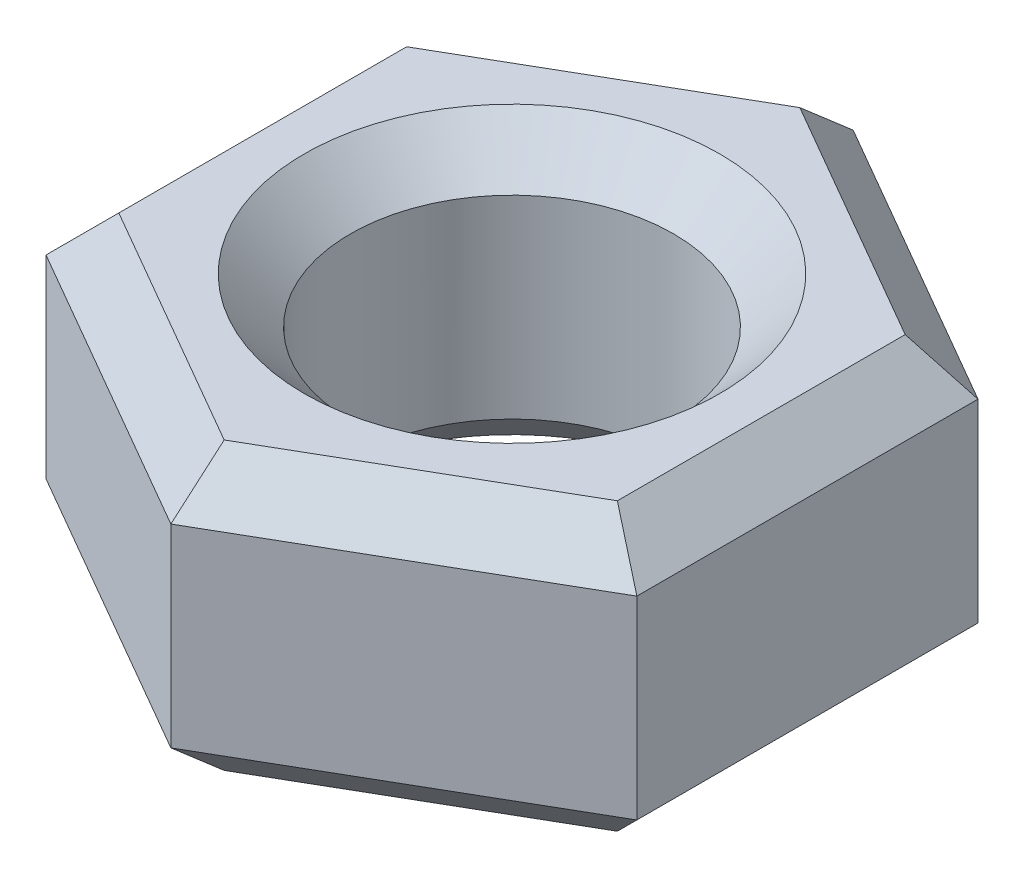
ISO-10303-21;
HEADER;
FILE_DESCRIPTION(('STEP AP214'),'2;1');
FILE_NAME('part.step','',(''),(''),'','','');
FILE_SCHEMA(('AUTOMOTIVE_DESIGN { 1 0 10303 214 1 1 1 1 }'));
ENDSEC;
DATA;
#1=APPLICATION_CONTEXT('core data for automotive mechanical design processes');
#2=APPLICATION_PROTOCOL_DEFINITION('international standard','automotive_design',2000,#1);
#3=PRODUCT_CONTEXT('',#1,'mechanical');
#4=PRODUCT('Part','Part','',(#3));
#5=PRODUCT_RELATED_PRODUCT_CATEGORY('part','',(#4));
#6=PRODUCT_DEFINITION_FORMATION('','',#4);
#7=PRODUCT_DEFINITION_CONTEXT('part definition',#1,'design');
#8=PRODUCT_DEFINITION('design','',#6,#7);
#9=PRODUCT_DEFINITION_SHAPE('','',#8);
#10=(LENGTH_UNIT() NAMED_UNIT(*) SI_UNIT(.MILLI.,.METRE.));
#11=(NAMED_UNIT(*) PLANE_ANGLE_UNIT() SI_UNIT($,.RADIAN.));
#12=(NAMED_UNIT(*) SI_UNIT($,.STERADIAN.) SOLID_ANGLE_UNIT());
#13=UNCERTAINTY_MEASURE_WITH_UNIT(LENGTH_MEASURE(1.E-05),#10,'distance_accuracy_value','');
#14=(GEOMETRIC_REPRESENTATION_CONTEXT(3) GLOBAL_UNCERTAINTY_ASSIGNED_CONTEXT((#13)) GLOBAL_UNIT_ASSIGNED_CONTEXT((#10,
#11,#12)) REPRESENTATION_CONTEXT('',''));
#15=CARTESIAN_POINT('',(0.,0.,0.));
#16=DIRECTION('',(0.,0.,1.));
#17=DIRECTION('',(1.,0.,0.));
#18=AXIS2_PLACEMENT_3D('',#15,#16,#17);
#19=CARTESIAN_POINT('',(0.,6.2,0.));
#20=DIRECTION('',(0.,1.,0.));
#21=DIRECTION('',(0.,0.,1.));
#22=AXIS2_PLACEMENT_3D('',#19,#20,#21);
#23=PLANE('',#22);
#24=CARTESIAN_POINT('',(0.,6.2,0.));
#25=DIRECTION('',(0.,1.,0.));
#26=DIRECTION('',(0.,0.,1.));
#27=AXIS2_PLACEMENT_3D('',#24,#25,#26);
#28=CIRCLE('',#27,4.50000000000001);
#29=CARTESIAN_POINT('',(0.,6.2,4.50000000000001));
#30=VERTEX_POINT('',#29);
#31=EDGE_CURVE('E11',#30,#30,#28,.F.);
#32=ORIENTED_EDGE('',*,*,#31,.T.);
#33=EDGE_LOOP('',(#32));
#34=FACE_BOUND('',#33,.T.);
#35=DIRECTION('',(0.,0.,1.));
#36=VECTOR('',#35,1.);
#37=CARTESIAN_POINT('',(-5.4,6.2,3.69504172281358));
#38=LINE('',#37,#36);
#39=CARTESIAN_POINT('',(-5.39999999999998,6.2,-3.117691453624));
#40=VERTEX_POINT('',#39);
#41=CARTESIAN_POINT('',(-5.4,6.2,3.11769145362395));
#42=VERTEX_POINT('',#41);
#43=EDGE_CURVE('E52',#40,#42,#38,.T.);
#44=ORIENTED_EDGE('',*,*,#43,.T.);
#45=DIRECTION('',(0.866025403784437,0.,0.500000000000003));
#46=VECTOR('',#45,1.);
#47=CARTESIAN_POINT('',(0.499999999999979,6.2,6.52405804184276));
#48=LINE('',#47,#46);
#49=CARTESIAN_POINT('',(0.,6.2,6.23538290724794));
#50=VERTEX_POINT('',#49);
#51=EDGE_CURVE('E44',#42,#50,#48,.T.);
#52=ORIENTED_EDGE('',*,*,#51,.T.);
#53=DIRECTION('',(0.86602540378444,0.,-0.499999999999997));
#54=VECTOR('',#53,1.);
#55=CARTESIAN_POINT('',(5.89999999999998,6.2,2.82901631902918));
#56=LINE('',#55,#54);
#57=CARTESIAN_POINT('',(5.39999999999998,6.2,3.11769145362399));
#58=VERTEX_POINT('',#57);
#59=EDGE_CURVE('E191',#50,#58,#56,.T.);
#60=ORIENTED_EDGE('',*,*,#59,.T.);
#61=DIRECTION('',(0.,0.,-1.));
#62=VECTOR('',#61,1.);
#63=CARTESIAN_POINT('',(5.40000000000002,6.2,-3.69504172281359));
#64=LINE('',#63,#62);
#65=CARTESIAN_POINT('',(5.40000000000001,6.2,-3.11769145362396));
#66=VERTEX_POINT('',#65);
#67=EDGE_CURVE('E193',#58,#66,#64,.T.);
#68=ORIENTED_EDGE('',*,*,#67,.T.);
#69=DIRECTION('',(-0.866025403784437,0.,-0.500000000000003));
#70=VECTOR('',#69,1.);
#71=CARTESIAN_POINT('',(-0.499999999999975,6.2,-6.52405804184278));
#72=LINE('',#71,#70);
#73=CARTESIAN_POINT('',(0.,6.2,-6.23538290724796));
#74=VERTEX_POINT('',#73);
#75=EDGE_CURVE('E195',#66,#74,#72,.T.);
#76=ORIENTED_EDGE('',*,*,#75,.T.);
#77=DIRECTION('',(-0.86602540378444,0.,0.499999999999997));
#78=VECTOR('',#77,1.);
#79=CARTESIAN_POINT('',(-5.89999999999999,6.2,-2.82901631902919));
#80=LINE('',#79,#78);
#81=EDGE_CURVE('E57',#74,#40,#80,.T.);
#82=ORIENTED_EDGE('',*,*,#81,.T.);
#83=EDGE_LOOP('',(#44,#52,#60,#68,#76,#82));
#84=FACE_BOUND('',#83,.T.);
#85=ADVANCED_FACE('F35',(#34,#84),#23,.T.);
#86=CARTESIAN_POINT('',(0.,0.,0.));
#87=DIRECTION('',(0.,1.,0.));
#88=DIRECTION('',(0.,0.,1.));
#89=AXIS2_PLACEMENT_3D('',#86,#87,#88);
#90=PLANE('',#89);
#91=CARTESIAN_POINT('',(0.,0.,0.));
#92=DIRECTION('',(0.,1.,0.));
#93=DIRECTION('',(0.,0.,1.));
#94=AXIS2_PLACEMENT_3D('',#91,#92,#93);
#95=CIRCLE('',#94,4.49999999999999);
#96=CARTESIAN_POINT('',(0.,0.,4.49999999999999));
#97=VERTEX_POINT('',#96);
#98=EDGE_CURVE('E153',#97,#97,#95,.T.);
#99=ORIENTED_EDGE('',*,*,#98,.T.);
#100=EDGE_LOOP('',(#99));
#101=FACE_BOUND('',#100,.T.);
#102=DIRECTION('',(0.866025403784437,0.,0.500000000000003));
#103=VECTOR('',#102,1.);
#104=CARTESIAN_POINT('',(2.70000000000002,0.,-4.67653718043596));
#105=LINE('',#104,#103);
#106=CARTESIAN_POINT('',(0.,0.,-6.23538290724796));
#107=VERTEX_POINT('',#106);
#108=CARTESIAN_POINT('',(5.40000000000002,0.,-3.11769145362396));
#109=VERTEX_POINT('',#108);
#110=EDGE_CURVE('E152',#107,#109,#105,.T.);
#111=ORIENTED_EDGE('',*,*,#110,.T.);
#112=DIRECTION('',(0.,0.,1.));
#113=VECTOR('',#112,1.);
#114=CARTESIAN_POINT('',(5.4,0.,0.));
#115=LINE('',#114,#113);
#116=CARTESIAN_POINT('',(5.39999999999998,0.,3.11769145362399));
#117=VERTEX_POINT('',#116);
#118=EDGE_CURVE('E131',#109,#117,#115,.T.);
#119=ORIENTED_EDGE('',*,*,#118,.T.);
#120=DIRECTION('',(-0.86602540378444,0.,0.499999999999997));
#121=VECTOR('',#120,1.);
#122=CARTESIAN_POINT('',(2.69999999999998,0.,4.67653718043597));
#123=LINE('',#122,#121);
#124=CARTESIAN_POINT('',(0.,0.,6.23538290724794));
#125=VERTEX_POINT('',#124);
#126=EDGE_CURVE('E141',#117,#125,#123,.T.);
#127=ORIENTED_EDGE('',*,*,#126,.T.);
#128=DIRECTION('',(-0.866025403784437,0.,-0.500000000000003));
#129=VECTOR('',#128,1.);
#130=CARTESIAN_POINT('',(-2.70000000000001,0.,4.67653718043595));
#131=LINE('',#130,#129);
#132=CARTESIAN_POINT('',(-5.4,0.,3.11769145362395));
#133=VERTEX_POINT('',#132);
#134=EDGE_CURVE('E147',#125,#133,#131,.T.);
#135=ORIENTED_EDGE('',*,*,#134,.T.);
#136=DIRECTION('',(0.,0.,-1.));
#137=VECTOR('',#136,1.);
#138=CARTESIAN_POINT('',(-5.39999999999999,0.,0.));
#139=LINE('',#138,#137);
#140=CARTESIAN_POINT('',(-5.39999999999999,0.,-3.117691453624));
#141=VERTEX_POINT('',#140);
#142=EDGE_CURVE('E253',#133,#141,#139,.T.);
#143=ORIENTED_EDGE('',*,*,#142,.T.);
#144=DIRECTION('',(0.86602540378444,0.,-0.499999999999997));
#145=VECTOR('',#144,1.);
#146=CARTESIAN_POINT('',(-2.69999999999999,0.,-4.67653718043598));
#147=LINE('',#146,#145);
#148=EDGE_CURVE('E158',#141,#107,#147,.T.);
#149=ORIENTED_EDGE('',*,*,#148,.T.);
#150=EDGE_LOOP('',(#111,#119,#127,#135,#143,#149));
#151=FACE_BOUND('',#150,.T.);
#152=ADVANCED_FACE('F150',(#101,#151),#90,.F.);
#153=CARTESIAN_POINT('',(0.,6.2,7.3900834456272));
#154=DIRECTION('',(-0.499999999999997,0.,-0.86602540378444));
#155=DIRECTION('',(-0.866025403784441,0.,0.499999999999997));
#156=AXIS2_PLACEMENT_3D('',#153,#154,#155);
#157=PLANE('',#156);
#158=DIRECTION('',(0.,-1.,0.));
#159=VECTOR('',#158,1.);
#160=CARTESIAN_POINT('',(0.,6.2,7.3900834456272));
#161=LINE('',#160,#159);
#162=CARTESIAN_POINT('',(0.,5.19999999999999,7.3900834456272));
#163=VERTEX_POINT('',#162);
#164=CARTESIAN_POINT('',(0.,0.999999999999999,7.3900834456272));
#165=VERTEX_POINT('',#164);
#166=EDGE_CURVE('E210',#163,#165,#161,.T.);
#167=ORIENTED_EDGE('',*,*,#166,.T.);
#168=DIRECTION('',(0.866025403784441,0.,-0.499999999999997));
#169=VECTOR('',#168,1.);
#170=CARTESIAN_POINT('',(0.,0.999999999999997,7.3900834456272));
#171=LINE('',#170,#169);
#172=CARTESIAN_POINT('',(6.39999999999997,0.999999999999999,3.69504172281362));
#173=VERTEX_POINT('',#172);
#174=EDGE_CURVE('E189',#165,#173,#171,.T.);
#175=ORIENTED_EDGE('',*,*,#174,.T.);
#176=DIRECTION('',(0.,-1.,0.));
#177=VECTOR('',#176,1.);
#178=CARTESIAN_POINT('',(6.39999999999997,6.2,3.69504172281362));
#179=LINE('',#178,#177);
#180=CARTESIAN_POINT('',(6.39999999999997,5.19999999999999,3.69504172281362));
#181=VERTEX_POINT('',#180);
#182=EDGE_CURVE('E148',#181,#173,#179,.T.);
#183=ORIENTED_EDGE('',*,*,#182,.F.);
#184=DIRECTION('',(-0.866025403784441,0.,0.499999999999997));
#185=VECTOR('',#184,1.);
#186=CARTESIAN_POINT('',(0.,5.19999999999999,7.3900834456272));
#187=LINE('',#186,#185);
#188=EDGE_CURVE('E187',#181,#163,#187,.T.);
#189=ORIENTED_EDGE('',*,*,#188,.T.);
#190=EDGE_LOOP('',(#167,#175,#183,#189));
#191=FACE_BOUND('',#190,.T.);
#192=ADVANCED_FACE('F277',(#191),#157,.F.);
#193=CARTESIAN_POINT('',(6.39999999999997,6.2,3.69504172281362));
#194=DIRECTION('',(-1.,0.,0.));
#195=DIRECTION('',(0.,0.,1.));
#196=AXIS2_PLACEMENT_3D('',#193,#194,#195);
#197=PLANE('',#196);
#198=ORIENTED_EDGE('',*,*,#182,.T.);
#199=DIRECTION('',(0.,0.,-1.));
#200=VECTOR('',#199,1.);
#201=CARTESIAN_POINT('',(6.39999999999997,0.999999999999997,3.69504172281362));
#202=LINE('',#201,#200);
#203=CARTESIAN_POINT('',(6.40000000000002,0.999999999999999,-3.69504172281359));
#204=VERTEX_POINT('',#203);
#205=EDGE_CURVE('E134',#173,#204,#202,.T.);
#206=ORIENTED_EDGE('',*,*,#205,.T.);
#207=DIRECTION('',(0.,-1.,0.));
#208=VECTOR('',#207,1.);
#209=CARTESIAN_POINT('',(6.40000000000002,6.2,-3.69504172281359));
#210=LINE('',#209,#208);
#211=CARTESIAN_POINT('',(6.40000000000002,5.19999999999999,-3.69504172281359));
#212=VERTEX_POINT('',#211);
#213=EDGE_CURVE('E239',#212,#204,#210,.T.);
#214=ORIENTED_EDGE('',*,*,#213,.F.);
#215=DIRECTION('',(0.,0.,1.));
#216=VECTOR('',#215,1.);
#217=CARTESIAN_POINT('',(6.39999999999997,5.19999999999999,3.69504172281362));
#218=LINE('',#217,#216);
#219=EDGE_CURVE('E167',#212,#181,#218,.T.);
#220=ORIENTED_EDGE('',*,*,#219,.T.);
#221=EDGE_LOOP('',(#198,#206,#214,#220));
#222=FACE_BOUND('',#221,.T.);
#223=ADVANCED_FACE('F244',(#222),#197,.F.);
#224=CARTESIAN_POINT('',(6.40000000000002,6.2,-3.69504172281359));
#225=DIRECTION('',(-0.500000000000003,0.,0.866025403784437));
#226=DIRECTION('',(0.866025403784437,0.,0.500000000000003));
#227=AXIS2_PLACEMENT_3D('',#224,#225,#226);
#228=PLANE('',#227);
#229=ORIENTED_EDGE('',*,*,#213,.T.);
#230=DIRECTION('',(-0.866025403784437,0.,-0.500000000000003));
#231=VECTOR('',#230,1.);
#232=CARTESIAN_POINT('',(6.40000000000002,0.999999999999997,-3.69504172281359));
#233=LINE('',#232,#231);
#234=CARTESIAN_POINT('',(0.,0.999999999999999,-7.39008344562722));
#235=VERTEX_POINT('',#234);
#236=EDGE_CURVE('E172',#204,#235,#233,.T.);
#237=ORIENTED_EDGE('',*,*,#236,.T.);
#238=DIRECTION('',(0.,-1.,0.));
#239=VECTOR('',#238,1.);
#240=CARTESIAN_POINT('',(0.,6.2,-7.39008344562722));
#241=LINE('',#240,#239);
#242=CARTESIAN_POINT('',(0.,5.19999999999999,-7.39008344562722));
#243=VERTEX_POINT('',#242);
#244=EDGE_CURVE('E241',#243,#235,#241,.T.);
#245=ORIENTED_EDGE('',*,*,#244,.F.);
#246=DIRECTION('',(0.866025403784437,0.,0.500000000000003));
#247=VECTOR('',#246,1.);
#248=CARTESIAN_POINT('',(6.40000000000002,5.19999999999999,-3.69504172281359));
#249=LINE('',#248,#247);
#250=EDGE_CURVE('E170',#243,#212,#249,.T.);
#251=ORIENTED_EDGE('',*,*,#250,.T.);
#252=EDGE_LOOP('',(#229,#237,#245,#251));
#253=FACE_BOUND('',#252,.T.);
#254=ADVANCED_FACE('F238',(#253),#228,.F.);
#255=CARTESIAN_POINT('',(0.,6.2,-7.39008344562722));
#256=DIRECTION('',(0.499999999999997,0.,0.86602540378444));
#257=DIRECTION('',(0.86602540378444,0.,-0.499999999999997));
#258=AXIS2_PLACEMENT_3D('',#255,#256,#257);
#259=PLANE('',#258);
#260=ORIENTED_EDGE('',*,*,#244,.T.);
#261=DIRECTION('',(-0.86602540378444,0.,0.499999999999997));
#262=VECTOR('',#261,1.);
#263=CARTESIAN_POINT('',(0.,0.999999999999997,-7.39008344562722));
#264=LINE('',#263,#262);
#265=CARTESIAN_POINT('',(-6.39999999999999,0.999999999999999,-3.69504172281363));
#266=VERTEX_POINT('',#265);
#267=EDGE_CURVE('E176',#235,#266,#264,.T.);
#268=ORIENTED_EDGE('',*,*,#267,.T.);
#269=DIRECTION('',(0.,-1.,0.));
#270=VECTOR('',#269,1.);
#271=CARTESIAN_POINT('',(-6.39999999999999,6.2,-3.69504172281363));
#272=LINE('',#271,#270);
#273=CARTESIAN_POINT('',(-6.39999999999999,5.19999999999999,-3.69504172281363));
#274=VERTEX_POINT('',#273);
#275=EDGE_CURVE('E248',#274,#266,#272,.T.);
#276=ORIENTED_EDGE('',*,*,#275,.F.);
#277=DIRECTION('',(0.86602540378444,0.,-0.499999999999997));
#278=VECTOR('',#277,1.);
#279=CARTESIAN_POINT('',(0.,5.19999999999999,-7.39008344562722));
#280=LINE('',#279,#278);
#281=EDGE_CURVE('E174',#274,#243,#280,.T.);
#282=ORIENTED_EDGE('',*,*,#281,.T.);
#283=EDGE_LOOP('',(#260,#268,#276,#282));
#284=FACE_BOUND('',#283,.T.);
#285=ADVANCED_FACE('F265',(#284),#259,.F.);
#286=CARTESIAN_POINT('',(-6.39999999999999,6.2,-3.69504172281363));
#287=DIRECTION('',(1.,0.,0.));
#288=DIRECTION('',(0.,0.,-1.));
#289=AXIS2_PLACEMENT_3D('',#286,#287,#288);
#290=PLANE('',#289);
#291=ORIENTED_EDGE('',*,*,#275,.T.);
#292=DIRECTION('',(0.,0.,1.));
#293=VECTOR('',#292,1.);
#294=CARTESIAN_POINT('',(-6.39999999999999,0.999999999999997,-3.69504172281363));
#295=LINE('',#294,#293);
#296=CARTESIAN_POINT('',(-6.4,0.999999999999998,3.69504172281358));
#297=VERTEX_POINT('',#296);
#298=EDGE_CURVE('E180',#266,#297,#295,.T.);
#299=ORIENTED_EDGE('',*,*,#298,.T.);
#300=DIRECTION('',(0.,-1.,0.));
#301=VECTOR('',#300,1.);
#302=CARTESIAN_POINT('',(-6.4,6.2,3.69504172281358));
#303=LINE('',#302,#301);
#304=CARTESIAN_POINT('',(-6.4,5.19999999999999,3.69504172281358));
#305=VERTEX_POINT('',#304);
#306=EDGE_CURVE('E270',#305,#297,#303,.T.);
#307=ORIENTED_EDGE('',*,*,#306,.F.);
#308=DIRECTION('',(0.,0.,-1.));
#309=VECTOR('',#308,1.);
#310=CARTESIAN_POINT('',(-6.39999999999999,5.19999999999999,-3.69504172281363));
#311=LINE('',#310,#309);
#312=EDGE_CURVE('E178',#305,#274,#311,.T.);
#313=ORIENTED_EDGE('',*,*,#312,.T.);
#314=EDGE_LOOP('',(#291,#299,#307,#313));
#315=FACE_BOUND('',#314,.T.);
#316=ADVANCED_FACE('F288',(#315),#290,.F.);
#317=CARTESIAN_POINT('',(-6.4,6.2,3.69504172281358));
#318=DIRECTION('',(0.500000000000003,0.,-0.866025403784437));
#319=DIRECTION('',(-0.866025403784437,0.,-0.500000000000003));
#320=AXIS2_PLACEMENT_3D('',#317,#318,#319);
#321=PLANE('',#320);
#322=ORIENTED_EDGE('',*,*,#306,.T.);
#323=DIRECTION('',(0.866025403784437,0.,0.500000000000003));
#324=VECTOR('',#323,1.);
#325=CARTESIAN_POINT('',(-6.4,0.999999999999997,3.69504172281358));
#326=LINE('',#325,#324);
#327=EDGE_CURVE('E185',#297,#165,#326,.T.);
#328=ORIENTED_EDGE('',*,*,#327,.T.);
#329=ORIENTED_EDGE('',*,*,#166,.F.);
#330=DIRECTION('',(-0.866025403784437,0.,-0.500000000000003));
#331=VECTOR('',#330,1.);
#332=CARTESIAN_POINT('',(-6.4,5.19999999999999,3.69504172281358));
#333=LINE('',#332,#331);
#334=EDGE_CURVE('E182',#163,#305,#333,.T.);
#335=ORIENTED_EDGE('',*,*,#334,.T.);
#336=EDGE_LOOP('',(#322,#328,#329,#335));
#337=FACE_BOUND('',#336,.T.);
#338=ADVANCED_FACE('F289',(#337),#321,.F.);
#339=CARTESIAN_POINT('',(0.,6.2,0.));
#340=DIRECTION('',(0.,-1.,0.));
#341=DIRECTION('',(0.,0.,-1.));
#342=AXIS2_PLACEMENT_3D('',#339,#340,#341);
#343=CYLINDRICAL_SURFACE('',#342,3.5);
#344=CARTESIAN_POINT('',(0.,0.999999999999995,0.));
#345=DIRECTION('',(0.,1.,0.));
#346=DIRECTION('',(0.,0.,1.));
#347=AXIS2_PLACEMENT_3D('',#344,#345,#346);
#348=CIRCLE('',#347,3.5);
#349=CARTESIAN_POINT('',(0.,0.999999999999994,-3.5));
#350=VERTEX_POINT('',#349);
#351=EDGE_CURVE('E164',#350,#350,#348,.F.);
#352=CARTESIAN_POINT('',(0.,5.19999999999999,0.));
#353=DIRECTION('',(0.,1.,0.));
#354=DIRECTION('',(0.,0.,1.));
#355=AXIS2_PLACEMENT_3D('',#352,#353,#354);
#356=CIRCLE('',#355,3.5);
#357=CARTESIAN_POINT('',(0.,5.19999999999999,-3.5));
#358=VERTEX_POINT('',#357);
#359=EDGE_CURVE('E156',#358,#358,#356,.T.);
#360=CARTESIAN_POINT('',(0.,0.999999999999994,-3.5));
#361=CARTESIAN_POINT('',(0.,1.04374999999999,-3.5));
#362=CARTESIAN_POINT('',(0.,1.08749999999999,-3.5));
#363=CARTESIAN_POINT('',(0.,1.17499999999999,-3.5));
#364=CARTESIAN_POINT('',(0.,1.21874999999999,-3.5));
#365=CARTESIAN_POINT('',(0.,1.30624999999999,-3.5));
#366=CARTESIAN_POINT('',(0.,1.34999999999999,-3.5));
#367=CARTESIAN_POINT('',(0.,1.43749999999999,-3.5));
#368=CARTESIAN_POINT('',(0.,1.48124999999999,-3.5));
#369=CARTESIAN_POINT('',(0.,1.56874999999999,-3.5));
#370=CARTESIAN_POINT('',(0.,1.61249999999999,-3.5));
#371=CARTESIAN_POINT('',(0.,1.69999999999999,-3.5));
#372=CARTESIAN_POINT('',(0.,1.74374999999999,-3.5));
#373=CARTESIAN_POINT('',(0.,1.83124999999999,-3.5));
#374=CARTESIAN_POINT('',(0.,1.87499999999999,-3.5));
#375=CARTESIAN_POINT('',(0.,1.96249999999999,-3.5));
#376=CARTESIAN_POINT('',(0.,2.00624999999999,-3.5));
#377=CARTESIAN_POINT('',(0.,2.09374999999999,-3.5));
#378=CARTESIAN_POINT('',(0.,2.13749999999999,-3.5));
#379=CARTESIAN_POINT('',(0.,2.22499999999999,-3.5));
#380=CARTESIAN_POINT('',(0.,2.26874999999999,-3.5));
#381=CARTESIAN_POINT('',(0.,2.35624999999999,-3.5));
#382=CARTESIAN_POINT('',(0.,2.39999999999999,-3.5));
#383=CARTESIAN_POINT('',(0.,2.48749999999999,-3.5));
#384=CARTESIAN_POINT('',(0.,2.53124999999999,-3.5));
#385=CARTESIAN_POINT('',(0.,2.61874999999999,-3.5));
#386=CARTESIAN_POINT('',(0.,2.66249999999999,-3.5));
#387=CARTESIAN_POINT('',(0.,2.74999999999999,-3.5));
#388=CARTESIAN_POINT('',(0.,2.79374999999999,-3.5));
#389=CARTESIAN_POINT('',(0.,2.88124999999999,-3.5));
#390=CARTESIAN_POINT('',(0.,2.92499999999999,-3.5));
#391=CARTESIAN_POINT('',(0.,3.01249999999999,-3.5));
#392=CARTESIAN_POINT('',(0.,3.05624999999999,-3.5));
#393=CARTESIAN_POINT('',(0.,3.14374999999999,-3.5));
#394=CARTESIAN_POINT('',(0.,3.18749999999999,-3.5));
#395=CARTESIAN_POINT('',(0.,3.27499999999999,-3.5));
#396=CARTESIAN_POINT('',(0.,3.31874999999999,-3.5));
#397=CARTESIAN_POINT('',(0.,3.40624999999999,-3.5));
#398=CARTESIAN_POINT('',(0.,3.44999999999999,-3.5));
#399=CARTESIAN_POINT('',(0.,3.53749999999999,-3.5));
#400=CARTESIAN_POINT('',(0.,3.58124999999999,-3.5));
#401=CARTESIAN_POINT('',(0.,3.66874999999999,-3.5));
#402=CARTESIAN_POINT('',(0.,3.71249999999999,-3.5));
#403=CARTESIAN_POINT('',(0.,3.79999999999999,-3.5));
#404=CARTESIAN_POINT('',(0.,3.84374999999999,-3.5));
#405=CARTESIAN_POINT('',(0.,3.93124999999999,-3.5));
#406=CARTESIAN_POINT('',(0.,3.97499999999999,-3.5));
#407=CARTESIAN_POINT('',(0.,4.06249999999999,-3.5));
#408=CARTESIAN_POINT('',(0.,4.10624999999999,-3.5));
#409=CARTESIAN_POINT('',(0.,4.19374999999999,-3.5));
#410=CARTESIAN_POINT('',(0.,4.23749999999999,-3.5));
#411=CARTESIAN_POINT('',(0.,4.32499999999999,-3.5));
#412=CARTESIAN_POINT('',(0.,4.36874999999999,-3.5));
#413=CARTESIAN_POINT('',(0.,4.45624999999999,-3.5));
#414=CARTESIAN_POINT('',(0.,4.49999999999999,-3.5));
#415=CARTESIAN_POINT('',(0.,4.58749999999999,-3.5));
#416=CARTESIAN_POINT('',(0.,4.63124999999999,-3.5));
#417=CARTESIAN_POINT('',(0.,4.71874999999999,-3.5));
#418=CARTESIAN_POINT('',(0.,4.76249999999999,-3.5));
#419=CARTESIAN_POINT('',(0.,4.84999999999999,-3.5));
#420=CARTESIAN_POINT('',(0.,4.89374999999999,-3.5));
#421=CARTESIAN_POINT('',(0.,4.98124999999999,-3.5));
#422=CARTESIAN_POINT('',(0.,5.02499999999999,-3.5));
#423=CARTESIAN_POINT('',(0.,5.11249999999999,-3.5));
#424=CARTESIAN_POINT('',(0.,5.15624999999999,-3.5));
#425=CARTESIAN_POINT('',(0.,5.19999999999999,-3.5));
#426=B_SPLINE_CURVE_WITH_KNOTS('',3,(#360,#361,#362,#363,#364,#365,#366,#367,#368,#369,#370,
#371,#372,#373,#374,#375,#376,#377,#378,#379,#380,#381,#382,#383,#384,#385,#386,#387,#388,#389,
#390,#391,#392,#393,#394,#395,#396,#397,#398,#399,#400,#401,#402,#403,#404,#405,#406,#407,#408,
#409,#410,#411,#412,#413,#414,#415,#416,#417,#418,#419,#420,#421,#422,#423,#424,#425),
.UNSPECIFIED.,.F.,.F.,(4,2,2,2,2,2,2,2,2,2,2,2,2,2,2,2,2,2,2,2,2,2,2,2,2,2,2,2,2,2,2,2,4),(0.,
0.13125,0.2625,0.39375,0.524999999999999,0.65625,0.7875,0.918749999999999,1.05,1.18125,1.3125,
1.44375,1.575,1.70625,1.8375,1.96875,2.1,2.23125,2.3625,2.49375,2.625,2.75625,2.8875,3.01875,
3.15,3.28125,3.4125,3.54375,3.675,3.80625,3.9375,4.06875,4.2),.UNSPECIFIED.);
#427=EDGE_CURVE('BSEAM308',#350,#358,#426,.T.);
#428=ORIENTED_EDGE('',*,*,#351,.T.);
#429=ORIENTED_EDGE('',*,*,#359,.T.);
#430=ORIENTED_EDGE('',*,*,#427,.T.);
#431=ORIENTED_EDGE('',*,*,#427,.F.);
#432=EDGE_LOOP('',(#428,#430,#429,#431));
#433=FACE_BOUND('',#432,.T.);
#434=ADVANCED_FACE('F308',(#433),#343,.F.);
#435=CARTESIAN_POINT('',(0.,0.,0.));
#436=DIRECTION('',(0.,-1.,0.));
#437=DIRECTION('',(0.,0.,-1.));
#438=AXIS2_PLACEMENT_3D('',#435,#436,#437);
#439=CONICAL_SURFACE('',#438,4.49999999999999,0.785398163397446);
#440=ORIENTED_EDGE('',*,*,#351,.F.);
#441=EDGE_LOOP('',(#440));
#442=FACE_BOUND('',#441,.T.);
#443=ORIENTED_EDGE('',*,*,#98,.F.);
#444=EDGE_LOOP('',(#443));
#445=FACE_BOUND('',#444,.T.);
#446=ADVANCED_FACE('F322',(#442,#445),#439,.F.);
#447=CARTESIAN_POINT('',(-6.39999999999999,0.999999999999997,-3.69504172281363));
#448=DIRECTION('',(0.707106781186547,0.707106781186548,0.));
#449=DIRECTION('',(0.,0.,1.));
#450=AXIS2_PLACEMENT_3D('',#447,#448,#449);
#451=PLANE('',#450);
#452=DIRECTION('',(0.654653670707977,-0.654653670707976,0.37796447300923));
#453=VECTOR('',#452,1.);
#454=CARTESIAN_POINT('',(-6.39999999999999,0.999999999999997,-3.69504172281363));
#455=LINE('',#454,#453);
#456=EDGE_CURVE('E204',#141,#266,#455,.F.);
#457=ORIENTED_EDGE('',*,*,#456,.F.);
#458=ORIENTED_EDGE('',*,*,#142,.F.);
#459=DIRECTION('',(0.654653670707978,-0.654653670707976,-0.377964473009226));
#460=VECTOR('',#459,1.);
#461=CARTESIAN_POINT('',(-6.4,0.999999999999997,3.69504172281358));
#462=LINE('',#461,#460);
#463=EDGE_CURVE('E207',#297,#133,#462,.T.);
#464=ORIENTED_EDGE('',*,*,#463,.F.);
#465=ORIENTED_EDGE('',*,*,#298,.F.);
#466=EDGE_LOOP('',(#457,#458,#464,#465));
#467=FACE_BOUND('',#466,.T.);
#468=ADVANCED_FACE('F286',(#467),#451,.F.);
#469=CARTESIAN_POINT('',(-6.4,0.999999999999997,3.69504172281358));
#470=DIRECTION('',(0.353553390593275,0.707106781186549,-0.612372435695792));
#471=DIRECTION('',(0.866025403784437,0.,0.500000000000003));
#472=AXIS2_PLACEMENT_3D('',#469,#470,#471);
#473=PLANE('',#472);
#474=ORIENTED_EDGE('',*,*,#463,.T.);
#475=ORIENTED_EDGE('',*,*,#134,.F.);
#476=DIRECTION('',(0.,-0.654653670707976,-0.755928946018455));
#477=VECTOR('',#476,1.);
#478=CARTESIAN_POINT('',(0.,0.999999999999997,7.3900834456272));
#479=LINE('',#478,#477);
#480=EDGE_CURVE('E144',#165,#125,#479,.T.);
#481=ORIENTED_EDGE('',*,*,#480,.F.);
#482=ORIENTED_EDGE('',*,*,#327,.F.);
#483=EDGE_LOOP('',(#474,#475,#481,#482));
#484=FACE_BOUND('',#483,.T.);
#485=ADVANCED_FACE('F283',(#484),#473,.F.);
#486=CARTESIAN_POINT('',(0.,0.999999999999997,-7.39008344562722));
#487=DIRECTION('',(0.353553390593271,0.707106781186548,0.612372435695795));
#488=DIRECTION('',(-0.86602540378444,0.,0.499999999999997));
#489=AXIS2_PLACEMENT_3D('',#486,#487,#488);
#490=PLANE('',#489);
#491=ORIENTED_EDGE('',*,*,#456,.T.);
#492=ORIENTED_EDGE('',*,*,#267,.F.);
#493=DIRECTION('',(0.,-0.654653670707976,0.755928946018456));
#494=VECTOR('',#493,1.);
#495=CARTESIAN_POINT('',(0.,0.999999999999997,-7.39008344562722));
#496=LINE('',#495,#494);
#497=EDGE_CURVE('E137',#107,#235,#496,.F.);
#498=ORIENTED_EDGE('',*,*,#497,.F.);
#499=ORIENTED_EDGE('',*,*,#148,.F.);
#500=EDGE_LOOP('',(#491,#492,#498,#499));
#501=FACE_BOUND('',#500,.T.);
#502=ADVANCED_FACE('F260',(#501),#490,.F.);
#503=CARTESIAN_POINT('',(0.,0.999999999999997,7.3900834456272));
#504=DIRECTION('',(-0.353553390593271,0.707106781186549,-0.612372435695795));
#505=DIRECTION('',(0.866025403784441,0.,-0.499999999999997));
#506=AXIS2_PLACEMENT_3D('',#503,#504,#505);
#507=PLANE('',#506);
#508=ORIENTED_EDGE('',*,*,#480,.T.);
#509=ORIENTED_EDGE('',*,*,#126,.F.);
#510=DIRECTION('',(0.654653670707975,0.654653670707977,0.377964473009232));
#511=VECTOR('',#510,1.);
#512=CARTESIAN_POINT('',(4.57142857142856,-0.828571428571417,2.63931551629544));
#513=LINE('',#512,#511);
#514=EDGE_CURVE('E127',#173,#117,#513,.F.);
#515=ORIENTED_EDGE('',*,*,#514,.F.);
#516=ORIENTED_EDGE('',*,*,#174,.F.);
#517=EDGE_LOOP('',(#508,#509,#515,#516));
#518=FACE_BOUND('',#517,.T.);
#519=ADVANCED_FACE('F142',(#518),#507,.F.);
#520=CARTESIAN_POINT('',(6.40000000000002,0.999999999999997,-3.69504172281359));
#521=DIRECTION('',(-0.353553390593275,0.707106781186549,0.612372435695792));
#522=DIRECTION('',(-0.866025403784437,0.,-0.500000000000003));
#523=AXIS2_PLACEMENT_3D('',#520,#521,#522);
#524=PLANE('',#523);
#525=ORIENTED_EDGE('',*,*,#497,.T.);
#526=ORIENTED_EDGE('',*,*,#236,.F.);
#527=DIRECTION('',(-0.654653670707979,-0.654653670707976,0.377964473009226));
#528=VECTOR('',#527,1.);
#529=CARTESIAN_POINT('',(6.40000000000002,0.999999999999997,-3.69504172281359));
#530=LINE('',#529,#528);
#531=EDGE_CURVE('E138',#109,#204,#530,.F.);
#532=ORIENTED_EDGE('',*,*,#531,.F.);
#533=ORIENTED_EDGE('',*,*,#110,.F.);
#534=EDGE_LOOP('',(#525,#526,#532,#533));
#535=FACE_BOUND('',#534,.T.);
#536=ADVANCED_FACE('F263',(#535),#524,.F.);
#537=CARTESIAN_POINT('',(6.39999999999997,0.999999999999997,3.69504172281362));
#538=DIRECTION('',(-0.707106781186547,0.707106781186548,0.));
#539=DIRECTION('',(0.,0.,-1.));
#540=AXIS2_PLACEMENT_3D('',#537,#538,#539);
#541=PLANE('',#540);
#542=ORIENTED_EDGE('',*,*,#514,.T.);
#543=ORIENTED_EDGE('',*,*,#118,.F.);
#544=ORIENTED_EDGE('',*,*,#531,.T.);
#545=ORIENTED_EDGE('',*,*,#205,.F.);
#546=EDGE_LOOP('',(#542,#543,#544,#545));
#547=FACE_BOUND('',#546,.T.);
#548=ADVANCED_FACE('F129',(#547),#541,.F.);
#549=CARTESIAN_POINT('',(0.,5.19999999999999,0.));
#550=DIRECTION('',(0.,1.,0.));
#551=DIRECTION('',(0.,0.,1.));
#552=AXIS2_PLACEMENT_3D('',#549,#550,#551);
#553=CONICAL_SURFACE('',#552,3.5,0.78539816339745);
#554=ORIENTED_EDGE('',*,*,#31,.F.);
#555=EDGE_LOOP('',(#554));
#556=FACE_BOUND('',#555,.T.);
#557=ORIENTED_EDGE('',*,*,#359,.F.);
#558=EDGE_LOOP('',(#557));
#559=FACE_BOUND('',#558,.T.);
#560=ADVANCED_FACE('F328',(#556,#559),#553,.F.);
#561=CARTESIAN_POINT('',(2.70000000000002,6.2,-4.67653718043596));
#562=DIRECTION('',(0.353553390593276,0.707106781186547,-0.612372435695794));
#563=DIRECTION('',(0.866025403784437,0.,0.500000000000003));
#564=AXIS2_PLACEMENT_3D('',#561,#562,#563);
#565=PLANE('',#564);
#566=DIRECTION('',(-0.654653670707977,0.654653670707978,0.377964473009225));
#567=VECTOR('',#566,1.);
#568=CARTESIAN_POINT('',(4.62857142857144,6.97142857142858,-2.67230696024911));
#569=LINE('',#568,#567);
#570=EDGE_CURVE('E220',#212,#66,#569,.T.);
#571=ORIENTED_EDGE('',*,*,#570,.F.);
#572=ORIENTED_EDGE('',*,*,#250,.F.);
#573=DIRECTION('',(0.,0.654653670707978,0.755928946018454));
#574=VECTOR('',#573,1.);
#575=CARTESIAN_POINT('',(0.,6.97142857142857,-5.34461392049826));
#576=LINE('',#575,#574);
#577=EDGE_CURVE('E39',#74,#243,#576,.F.);
#578=ORIENTED_EDGE('',*,*,#577,.F.);
#579=ORIENTED_EDGE('',*,*,#75,.F.);
#580=EDGE_LOOP('',(#571,#572,#578,#579));
#581=FACE_BOUND('',#580,.T.);
#582=ADVANCED_FACE('F37',(#581),#565,.T.);
#583=CARTESIAN_POINT('',(-2.69999999999998,6.2,-4.67653718043598));
#584=DIRECTION('',(-0.353553390593272,0.707106781186546,-0.612372435695797));
#585=DIRECTION('',(0.86602540378444,0.,-0.499999999999997));
#586=AXIS2_PLACEMENT_3D('',#583,#584,#585);
#587=PLANE('',#586);
#588=ORIENTED_EDGE('',*,*,#577,.T.);
#589=ORIENTED_EDGE('',*,*,#281,.F.);
#590=DIRECTION('',(0.654653670707975,0.654653670707978,0.377964473009229));
#591=VECTOR('',#590,1.);
#592=CARTESIAN_POINT('',(-4.62857142857142,6.97142857142857,-2.67230696024914));
#593=LINE('',#592,#591);
#594=EDGE_CURVE('E218',#40,#274,#593,.F.);
#595=ORIENTED_EDGE('',*,*,#594,.F.);
#596=ORIENTED_EDGE('',*,*,#81,.F.);
#597=EDGE_LOOP('',(#588,#589,#595,#596));
#598=FACE_BOUND('',#597,.T.);
#599=ADVANCED_FACE('F230',(#598),#587,.T.);
#600=CARTESIAN_POINT('',(5.4,6.2,0.));
#601=DIRECTION('',(0.707106781186549,0.707106781186546,0.));
#602=DIRECTION('',(0.,0.,1.));
#603=AXIS2_PLACEMENT_3D('',#600,#601,#602);
#604=PLANE('',#603);
#605=ORIENTED_EDGE('',*,*,#570,.T.);
#606=ORIENTED_EDGE('',*,*,#67,.F.);
#607=DIRECTION('',(-0.654653670707974,0.654653670707979,-0.37796447300923));
#608=VECTOR('',#607,1.);
#609=CARTESIAN_POINT('',(4.62857142857141,6.97142857142857,2.67230696024914));
#610=LINE('',#609,#608);
#611=EDGE_CURVE('E215',#181,#58,#610,.T.);
#612=ORIENTED_EDGE('',*,*,#611,.F.);
#613=ORIENTED_EDGE('',*,*,#219,.F.);
#614=EDGE_LOOP('',(#605,#606,#612,#613));
#615=FACE_BOUND('',#614,.T.);
#616=ADVANCED_FACE('F349',(#615),#604,.T.);
#617=CARTESIAN_POINT('',(-5.39999999999999,6.2,0.));
#618=DIRECTION('',(-0.707106781186549,0.707106781186546,0.));
#619=DIRECTION('',(0.,0.,-1.));
#620=AXIS2_PLACEMENT_3D('',#617,#618,#619);
#621=PLANE('',#620);
#622=ORIENTED_EDGE('',*,*,#594,.T.);
#623=ORIENTED_EDGE('',*,*,#312,.F.);
#624=DIRECTION('',(0.654653670707977,0.654653670707979,-0.377964473009225));
#625=VECTOR('',#624,1.);
#626=CARTESIAN_POINT('',(-4.62857142857143,6.97142857142857,2.6723069602491));
#627=LINE('',#626,#625);
#628=EDGE_CURVE('E213',#42,#305,#627,.F.);
#629=ORIENTED_EDGE('',*,*,#628,.F.);
#630=ORIENTED_EDGE('',*,*,#43,.F.);
#631=EDGE_LOOP('',(#622,#623,#629,#630));
#632=FACE_BOUND('',#631,.T.);
#633=ADVANCED_FACE('F346',(#632),#621,.T.);
#634=CARTESIAN_POINT('',(2.69999999999998,6.2,4.67653718043597));
#635=DIRECTION('',(0.353553390593272,0.707106781186546,0.612372435695797));
#636=DIRECTION('',(-0.866025403784441,0.,0.499999999999997));
#637=AXIS2_PLACEMENT_3D('',#634,#635,#636);
#638=PLANE('',#637);
#639=ORIENTED_EDGE('',*,*,#611,.T.);
#640=ORIENTED_EDGE('',*,*,#59,.F.);
#641=DIRECTION('',(0.,-0.654653670707979,0.755928946018453));
#642=VECTOR('',#641,1.);
#643=CARTESIAN_POINT('',(0.,6.97142857142857,5.34461392049824));
#644=LINE('',#643,#642);
#645=EDGE_CURVE('E211',#163,#50,#644,.F.);
#646=ORIENTED_EDGE('',*,*,#645,.F.);
#647=ORIENTED_EDGE('',*,*,#188,.F.);
#648=EDGE_LOOP('',(#639,#640,#646,#647));
#649=FACE_BOUND('',#648,.T.);
#650=ADVANCED_FACE('F297',(#649),#638,.T.);
#651=CARTESIAN_POINT('',(-2.70000000000001,6.2,4.67653718043595));
#652=DIRECTION('',(-0.353553390593277,0.707106781186546,0.612372435695795));
#653=DIRECTION('',(-0.866025403784437,0.,-0.500000000000003));
#654=AXIS2_PLACEMENT_3D('',#651,#652,#653);
#655=PLANE('',#654);
#656=ORIENTED_EDGE('',*,*,#628,.T.);
#657=ORIENTED_EDGE('',*,*,#334,.F.);
#658=ORIENTED_EDGE('',*,*,#645,.T.);
#659=ORIENTED_EDGE('',*,*,#51,.F.);
#660=EDGE_LOOP('',(#656,#657,#658,#659));
#661=FACE_BOUND('',#660,.T.);
#662=ADVANCED_FACE('F292',(#661),#655,.T.);
#663=CLOSED_SHELL('',(#85,#152,#192,#223,#254,#285,#316,#338,#434,#446,#468,#485,#502,#519,#536,
#548,#560,#582,#599,#616,#633,#650,#662));
#664=MANIFOLD_SOLID_BREP('B2',#663);
#665=ADVANCED_BREP_SHAPE_REPRESENTATION('',(#18,#664),#14);
#666=SHAPE_DEFINITION_REPRESENTATION(#9,#665);
ENDSEC;
END-ISO-10303-21;
